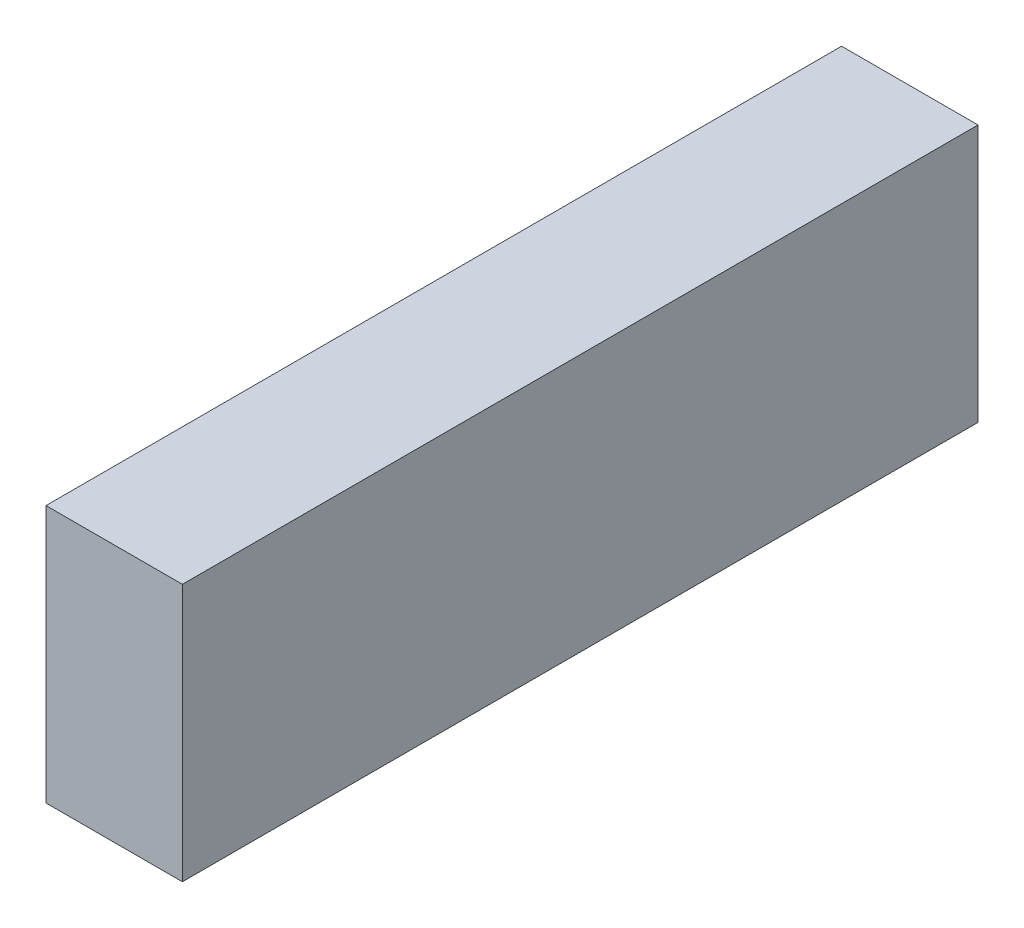
ISO-10303-21;
HEADER;
FILE_DESCRIPTION(('STEP AP214'),'2;1');
FILE_NAME('part.step','',(''),(''),'','','');
FILE_SCHEMA(('AUTOMOTIVE_DESIGN { 1 0 10303 214 1 1 1 1 }'));
ENDSEC;
DATA;
#1=APPLICATION_CONTEXT('core data for automotive mechanical design processes');
#2=APPLICATION_PROTOCOL_DEFINITION('international standard','automotive_design',2000,#1);
#3=PRODUCT_CONTEXT('',#1,'mechanical');
#4=PRODUCT('Part','Part','',(#3));
#5=PRODUCT_RELATED_PRODUCT_CATEGORY('part','',(#4));
#6=PRODUCT_DEFINITION_FORMATION('','',#4);
#7=PRODUCT_DEFINITION_CONTEXT('part definition',#1,'design');
#8=PRODUCT_DEFINITION('design','',#6,#7);
#9=PRODUCT_DEFINITION_SHAPE('','',#8);
#10=(LENGTH_UNIT() NAMED_UNIT(*) SI_UNIT(.MILLI.,.METRE.));
#11=(NAMED_UNIT(*) PLANE_ANGLE_UNIT() SI_UNIT($,.RADIAN.));
#12=(NAMED_UNIT(*) SI_UNIT($,.STERADIAN.) SOLID_ANGLE_UNIT());
#13=UNCERTAINTY_MEASURE_WITH_UNIT(LENGTH_MEASURE(1.E-05),#10,'distance_accuracy_value','');
#14=(GEOMETRIC_REPRESENTATION_CONTEXT(3) GLOBAL_UNCERTAINTY_ASSIGNED_CONTEXT((#13)) GLOBAL_UNIT_ASSIGNED_CONTEXT((#10,
#11,#12)) REPRESENTATION_CONTEXT('',''));
#15=CARTESIAN_POINT('',(0.,0.,0.));
#16=DIRECTION('',(0.,0.,1.));
#17=DIRECTION('',(1.,0.,0.));
#18=AXIS2_PLACEMENT_3D('',#15,#16,#17);
#19=CARTESIAN_POINT('',(0.,0.,105.));
#20=DIRECTION('',(0.,1.,0.));
#21=DIRECTION('',(0.,0.,1.));
#22=AXIS2_PLACEMENT_3D('',#19,#20,#21);
#23=PLANE('',#22);
#24=DIRECTION('',(1.,0.,0.));
#25=VECTOR('',#24,1.);
#26=CARTESIAN_POINT('',(0.,0.,0.));
#27=LINE('',#26,#25);
#28=CARTESIAN_POINT('',(0.,0.,0.));
#29=VERTEX_POINT('',#28);
#30=CARTESIAN_POINT('',(18.,0.,0.));
#31=VERTEX_POINT('',#30);
#32=EDGE_CURVE('E104',#29,#31,#27,.T.);
#33=ORIENTED_EDGE('',*,*,#32,.T.);
#34=DIRECTION('',(0.,0.,-1.));
#35=VECTOR('',#34,1.);
#36=CARTESIAN_POINT('',(18.,0.,105.));
#37=LINE('',#36,#35);
#38=CARTESIAN_POINT('',(18.,0.,105.));
#39=VERTEX_POINT('',#38);
#40=EDGE_CURVE('E11',#39,#31,#37,.T.);
#41=ORIENTED_EDGE('',*,*,#40,.F.);
#42=DIRECTION('',(1.,0.,0.));
#43=VECTOR('',#42,1.);
#44=CARTESIAN_POINT('',(0.,0.,105.));
#45=LINE('',#44,#43);
#46=CARTESIAN_POINT('',(0.,0.,105.));
#47=VERTEX_POINT('',#46);
#48=EDGE_CURVE('E90',#47,#39,#45,.T.);
#49=ORIENTED_EDGE('',*,*,#48,.F.);
#50=DIRECTION('',(0.,0.,-1.));
#51=VECTOR('',#50,1.);
#52=CARTESIAN_POINT('',(0.,0.,105.));
#53=LINE('',#52,#51);
#54=EDGE_CURVE('E57',#47,#29,#53,.T.);
#55=ORIENTED_EDGE('',*,*,#54,.T.);
#56=EDGE_LOOP('',(#33,#41,#49,#55));
#57=FACE_BOUND('',#56,.T.);
#58=ADVANCED_FACE('F41',(#57),#23,.F.);
#59=CARTESIAN_POINT('',(18.,0.,105.));
#60=DIRECTION('',(-1.,0.,0.));
#61=DIRECTION('',(0.,0.,1.));
#62=AXIS2_PLACEMENT_3D('',#59,#60,#61);
#63=PLANE('',#62);
#64=DIRECTION('',(0.,1.,0.));
#65=VECTOR('',#64,1.);
#66=CARTESIAN_POINT('',(18.,0.,0.));
#67=LINE('',#66,#65);
#68=CARTESIAN_POINT('',(18.,34.,0.));
#69=VERTEX_POINT('',#68);
#70=EDGE_CURVE('E95',#31,#69,#67,.T.);
#71=ORIENTED_EDGE('',*,*,#70,.T.);
#72=DIRECTION('',(0.,0.,-1.));
#73=VECTOR('',#72,1.);
#74=CARTESIAN_POINT('',(18.,34.,105.));
#75=LINE('',#74,#73);
#76=CARTESIAN_POINT('',(18.,34.,105.));
#77=VERTEX_POINT('',#76);
#78=EDGE_CURVE('E49',#77,#69,#75,.T.);
#79=ORIENTED_EDGE('',*,*,#78,.F.);
#80=DIRECTION('',(0.,1.,0.));
#81=VECTOR('',#80,1.);
#82=CARTESIAN_POINT('',(18.,0.,105.));
#83=LINE('',#82,#81);
#84=EDGE_CURVE('E82',#39,#77,#83,.T.);
#85=ORIENTED_EDGE('',*,*,#84,.F.);
#86=ORIENTED_EDGE('',*,*,#40,.T.);
#87=EDGE_LOOP('',(#71,#79,#85,#86));
#88=FACE_BOUND('',#87,.T.);
#89=ADVANCED_FACE('F94',(#88),#63,.F.);
#90=CARTESIAN_POINT('',(0.,34.,105.));
#91=DIRECTION('',(0.,1.,0.));
#92=DIRECTION('',(0.,0.,1.));
#93=AXIS2_PLACEMENT_3D('',#90,#91,#92);
#94=PLANE('',#93);
#95=DIRECTION('',(1.,0.,0.));
#96=VECTOR('',#95,1.);
#97=CARTESIAN_POINT('',(0.,34.,0.));
#98=LINE('',#97,#96);
#99=CARTESIAN_POINT('',(0.,34.,0.));
#100=VERTEX_POINT('',#99);
#101=EDGE_CURVE('E107',#100,#69,#98,.T.);
#102=ORIENTED_EDGE('',*,*,#101,.F.);
#103=DIRECTION('',(0.,0.,-1.));
#104=VECTOR('',#103,1.);
#105=CARTESIAN_POINT('',(0.,34.,105.));
#106=LINE('',#105,#104);
#107=CARTESIAN_POINT('',(0.,34.,105.));
#108=VERTEX_POINT('',#107);
#109=EDGE_CURVE('E71',#108,#100,#106,.T.);
#110=ORIENTED_EDGE('',*,*,#109,.F.);
#111=DIRECTION('',(1.,0.,0.));
#112=VECTOR('',#111,1.);
#113=CARTESIAN_POINT('',(0.,34.,105.));
#114=LINE('',#113,#112);
#115=EDGE_CURVE('E89',#108,#77,#114,.T.);
#116=ORIENTED_EDGE('',*,*,#115,.T.);
#117=ORIENTED_EDGE('',*,*,#78,.T.);
#118=EDGE_LOOP('',(#102,#110,#116,#117));
#119=FACE_BOUND('',#118,.T.);
#120=ADVANCED_FACE('F98',(#119),#94,.T.);
#121=CARTESIAN_POINT('',(0.,0.,105.));
#122=DIRECTION('',(-1.,0.,0.));
#123=DIRECTION('',(0.,0.,1.));
#124=AXIS2_PLACEMENT_3D('',#121,#122,#123);
#125=PLANE('',#124);
#126=DIRECTION('',(0.,1.,0.));
#127=VECTOR('',#126,1.);
#128=CARTESIAN_POINT('',(0.,0.,0.));
#129=LINE('',#128,#127);
#130=EDGE_CURVE('E109',#29,#100,#129,.T.);
#131=ORIENTED_EDGE('',*,*,#130,.F.);
#132=ORIENTED_EDGE('',*,*,#54,.F.);
#133=DIRECTION('',(0.,1.,0.));
#134=VECTOR('',#133,1.);
#135=CARTESIAN_POINT('',(0.,0.,105.));
#136=LINE('',#135,#134);
#137=EDGE_CURVE('E99',#47,#108,#136,.T.);
#138=ORIENTED_EDGE('',*,*,#137,.T.);
#139=ORIENTED_EDGE('',*,*,#109,.T.);
#140=EDGE_LOOP('',(#131,#132,#138,#139));
#141=FACE_BOUND('',#140,.T.);
#142=ADVANCED_FACE('F115',(#141),#125,.T.);
#143=CARTESIAN_POINT('',(0.,0.,105.));
#144=DIRECTION('',(0.,0.,1.));
#145=DIRECTION('',(1.,0.,0.));
#146=AXIS2_PLACEMENT_3D('',#143,#144,#145);
#147=PLANE('',#146);
#148=ORIENTED_EDGE('',*,*,#48,.T.);
#149=ORIENTED_EDGE('',*,*,#84,.T.);
#150=ORIENTED_EDGE('',*,*,#115,.F.);
#151=ORIENTED_EDGE('',*,*,#137,.F.);
#152=EDGE_LOOP('',(#148,#149,#150,#151));
#153=FACE_BOUND('',#152,.T.);
#154=ADVANCED_FACE('F86',(#153),#147,.T.);
#155=CARTESIAN_POINT('',(0.,0.,0.));
#156=DIRECTION('',(0.,0.,1.));
#157=DIRECTION('',(1.,0.,0.));
#158=AXIS2_PLACEMENT_3D('',#155,#156,#157);
#159=PLANE('',#158);
#160=ORIENTED_EDGE('',*,*,#32,.F.);
#161=ORIENTED_EDGE('',*,*,#130,.T.);
#162=ORIENTED_EDGE('',*,*,#101,.T.);
#163=ORIENTED_EDGE('',*,*,#70,.F.);
#164=EDGE_LOOP('',(#160,#161,#162,#163));
#165=FACE_BOUND('',#164,.T.);
#166=ADVANCED_FACE('F114',(#165),#159,.F.);
#167=CLOSED_SHELL('',(#58,#89,#120,#142,#154,#166));
#168=MANIFOLD_SOLID_BREP('B2',#167);
#169=ADVANCED_BREP_SHAPE_REPRESENTATION('',(#18,#168),#14);
#170=SHAPE_DEFINITION_REPRESENTATION(#9,#169);
ENDSEC;
END-ISO-10303-21;
